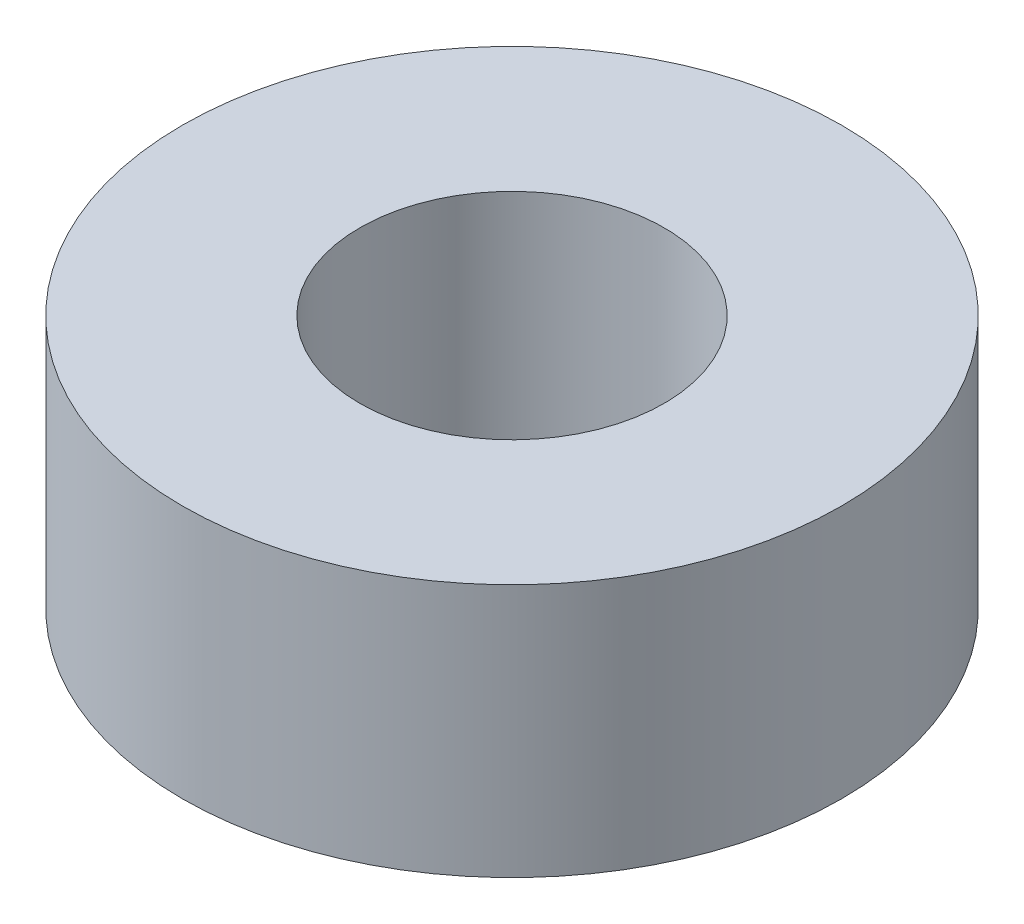
ISO-10303-21;
HEADER;
FILE_DESCRIPTION(('STEP AP214'),'2;1');
FILE_NAME('part.step','',(''),(''),'','','');
FILE_SCHEMA(('AUTOMOTIVE_DESIGN { 1 0 10303 214 1 1 1 1 }'));
ENDSEC;
DATA;
#1=APPLICATION_CONTEXT('core data for automotive mechanical design processes');
#2=APPLICATION_PROTOCOL_DEFINITION('international standard','automotive_design',2000,#1);
#3=PRODUCT_CONTEXT('',#1,'mechanical');
#4=PRODUCT('Part','Part','',(#3));
#5=PRODUCT_RELATED_PRODUCT_CATEGORY('part','',(#4));
#6=PRODUCT_DEFINITION_FORMATION('','',#4);
#7=PRODUCT_DEFINITION_CONTEXT('part definition',#1,'design');
#8=PRODUCT_DEFINITION('design','',#6,#7);
#9=PRODUCT_DEFINITION_SHAPE('','',#8);
#10=(LENGTH_UNIT() NAMED_UNIT(*) SI_UNIT(.MILLI.,.METRE.));
#11=(NAMED_UNIT(*) PLANE_ANGLE_UNIT() SI_UNIT($,.RADIAN.));
#12=(NAMED_UNIT(*) SI_UNIT($,.STERADIAN.) SOLID_ANGLE_UNIT());
#13=UNCERTAINTY_MEASURE_WITH_UNIT(LENGTH_MEASURE(1.E-05),#10,'distance_accuracy_value','');
#14=(GEOMETRIC_REPRESENTATION_CONTEXT(3) GLOBAL_UNCERTAINTY_ASSIGNED_CONTEXT((#13)) GLOBAL_UNIT_ASSIGNED_CONTEXT((#10,
#11,#12)) REPRESENTATION_CONTEXT('',''));
#15=CARTESIAN_POINT('',(0.,0.,0.));
#16=DIRECTION('',(0.,0.,1.));
#17=DIRECTION('',(1.,0.,0.));
#18=AXIS2_PLACEMENT_3D('',#15,#16,#17);
#19=CARTESIAN_POINT('',(0.,5.,0.));
#20=DIRECTION('',(0.,1.,0.));
#21=DIRECTION('',(0.,0.,1.));
#22=AXIS2_PLACEMENT_3D('',#19,#20,#21);
#23=PLANE('',#22);
#24=CARTESIAN_POINT('',(0.,5.,0.));
#25=DIRECTION('',(0.,1.,0.));
#26=DIRECTION('',(0.,0.,1.));
#27=AXIS2_PLACEMENT_3D('',#24,#25,#26);
#28=CIRCLE('',#27,6.5);
#29=CARTESIAN_POINT('',(0.,5.,6.5));
#30=VERTEX_POINT('',#29);
#31=EDGE_CURVE('E10',#30,#30,#28,.T.);
#32=ORIENTED_EDGE('',*,*,#31,.T.);
#33=EDGE_LOOP('',(#32));
#34=FACE_BOUND('',#33,.T.);
#35=CARTESIAN_POINT('',(0.,5.,0.));
#36=DIRECTION('',(0.,1.,0.));
#37=DIRECTION('',(0.,0.,1.));
#38=AXIS2_PLACEMENT_3D('',#35,#36,#37);
#39=CIRCLE('',#38,3.);
#40=CARTESIAN_POINT('',(0.,5.,3.));
#41=VERTEX_POINT('',#40);
#42=EDGE_CURVE('E42',#41,#41,#39,.T.);
#43=ORIENTED_EDGE('',*,*,#42,.F.);
#44=EDGE_LOOP('',(#43));
#45=FACE_BOUND('',#44,.T.);
#46=ADVANCED_FACE('F31',(#34,#45),#23,.T.);
#47=CARTESIAN_POINT('',(0.,0.,0.));
#48=DIRECTION('',(0.,1.,0.));
#49=DIRECTION('',(0.,0.,1.));
#50=AXIS2_PLACEMENT_3D('',#47,#48,#49);
#51=PLANE('',#50);
#52=CARTESIAN_POINT('',(0.,0.,0.));
#53=DIRECTION('',(0.,1.,0.));
#54=DIRECTION('',(0.,0.,1.));
#55=AXIS2_PLACEMENT_3D('',#52,#53,#54);
#56=CIRCLE('',#55,6.5);
#57=CARTESIAN_POINT('',(0.,0.,6.5));
#58=VERTEX_POINT('',#57);
#59=EDGE_CURVE('E35',#58,#58,#56,.T.);
#60=ORIENTED_EDGE('',*,*,#59,.F.);
#61=EDGE_LOOP('',(#60));
#62=FACE_BOUND('',#61,.T.);
#63=CARTESIAN_POINT('',(0.,0.,0.));
#64=DIRECTION('',(0.,1.,0.));
#65=DIRECTION('',(0.,0.,1.));
#66=AXIS2_PLACEMENT_3D('',#63,#64,#65);
#67=CIRCLE('',#66,3.);
#68=CARTESIAN_POINT('',(0.,0.,3.));
#69=VERTEX_POINT('',#68);
#70=EDGE_CURVE('E44',#69,#69,#67,.T.);
#71=ORIENTED_EDGE('',*,*,#70,.T.);
#72=EDGE_LOOP('',(#71));
#73=FACE_BOUND('',#72,.T.);
#74=ADVANCED_FACE('F54',(#62,#73),#51,.F.);
#75=CARTESIAN_POINT('',(0.,5.,0.));
#76=DIRECTION('',(0.,-1.,0.));
#77=DIRECTION('',(0.,0.,-1.));
#78=AXIS2_PLACEMENT_3D('',#75,#76,#77);
#79=CYLINDRICAL_SURFACE('',#78,6.5);
#80=ORIENTED_EDGE('',*,*,#31,.F.);
#81=EDGE_LOOP('',(#80));
#82=FACE_BOUND('',#81,.T.);
#83=ORIENTED_EDGE('',*,*,#59,.T.);
#84=EDGE_LOOP('',(#83));
#85=FACE_BOUND('',#84,.T.);
#86=ADVANCED_FACE('F33',(#82,#85),#79,.T.);
#87=CARTESIAN_POINT('',(0.,5.,0.));
#88=DIRECTION('',(0.,-1.,0.));
#89=DIRECTION('',(0.,0.,-1.));
#90=AXIS2_PLACEMENT_3D('',#87,#88,#89);
#91=CYLINDRICAL_SURFACE('',#90,3.);
#92=ORIENTED_EDGE('',*,*,#42,.T.);
#93=EDGE_LOOP('',(#92));
#94=FACE_BOUND('',#93,.T.);
#95=ORIENTED_EDGE('',*,*,#70,.F.);
#96=EDGE_LOOP('',(#95));
#97=FACE_BOUND('',#96,.T.);
#98=ADVANCED_FACE('F50',(#94,#97),#91,.F.);
#99=CLOSED_SHELL('',(#46,#74,#86,#98));
#100=MANIFOLD_SOLID_BREP('B2',#99);
#101=ADVANCED_BREP_SHAPE_REPRESENTATION('',(#18,#100),#14);
#102=SHAPE_DEFINITION_REPRESENTATION(#9,#101);
ENDSEC;
END-ISO-10303-21;
